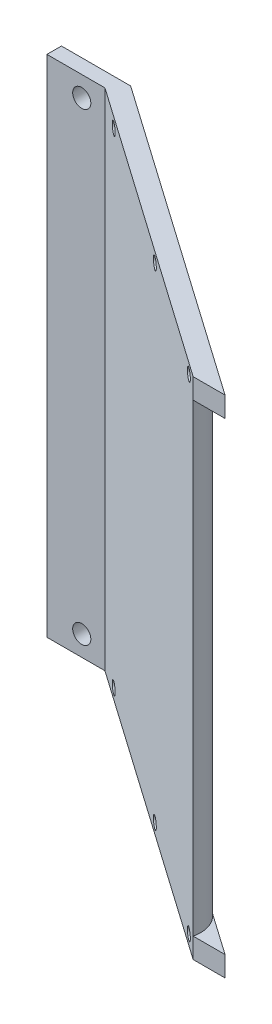
ISO-10303-21;
HEADER;
FILE_DESCRIPTION(('STEP AP214'),'2;1');
FILE_NAME('part.step','',(''),(''),'','','');
FILE_SCHEMA(('AUTOMOTIVE_DESIGN { 1 0 10303 214 1 1 1 1 }'));
ENDSEC;
DATA;
#1=APPLICATION_CONTEXT('core data for automotive mechanical design processes');
#2=APPLICATION_PROTOCOL_DEFINITION('international standard','automotive_design',2000,#1);
#3=PRODUCT_CONTEXT('',#1,'mechanical');
#4=PRODUCT('Part','Part','',(#3));
#5=PRODUCT_RELATED_PRODUCT_CATEGORY('part','',(#4));
#6=PRODUCT_DEFINITION_FORMATION('','',#4);
#7=PRODUCT_DEFINITION_CONTEXT('part definition',#1,'design');
#8=PRODUCT_DEFINITION('design','',#6,#7);
#9=PRODUCT_DEFINITION_SHAPE('','',#8);
#10=(LENGTH_UNIT() NAMED_UNIT(*) SI_UNIT(.MILLI.,.METRE.));
#11=(NAMED_UNIT(*) PLANE_ANGLE_UNIT() SI_UNIT($,.RADIAN.));
#12=(NAMED_UNIT(*) SI_UNIT($,.STERADIAN.) SOLID_ANGLE_UNIT());
#13=UNCERTAINTY_MEASURE_WITH_UNIT(LENGTH_MEASURE(1.E-05),#10,'distance_accuracy_value','');
#14=(GEOMETRIC_REPRESENTATION_CONTEXT(3) GLOBAL_UNCERTAINTY_ASSIGNED_CONTEXT((#13)) GLOBAL_UNIT_ASSIGNED_CONTEXT((#10,
#11,#12)) REPRESENTATION_CONTEXT('',''));
#15=CARTESIAN_POINT('',(0.,0.,0.));
#16=DIRECTION('',(0.,0.,1.));
#17=DIRECTION('',(1.,0.,0.));
#18=AXIS2_PLACEMENT_3D('',#15,#16,#17);
#19=CARTESIAN_POINT('',(-137.811683140464,160.,17.3992487375905));
#20=DIRECTION('',(1.,0.,0.));
#21=DIRECTION('',(0.,0.,-1.));
#22=AXIS2_PLACEMENT_3D('',#19,#20,#21);
#23=PLANE('',#22);
#24=DIRECTION('',(0.,-1.,0.));
#25=VECTOR('',#24,1.);
#26=CARTESIAN_POINT('',(-137.811683140464,160.,17.3992487375905));
#27=LINE('',#26,#25);
#28=CARTESIAN_POINT('',(-137.811683140464,167.,17.3992487375905));
#29=VERTEX_POINT('',#28);
#30=CARTESIAN_POINT('',(-137.811683140464,-7.,17.3992487375905));
#31=VERTEX_POINT('',#30);
#32=EDGE_CURVE('E183',#29,#31,#27,.T.);
#33=ORIENTED_EDGE('',*,*,#32,.T.);
#34=DIRECTION('',(0.,0.,1.));
#35=VECTOR('',#34,1.);
#36=CARTESIAN_POINT('',(-137.811683140464,-7.,17.3992487375905));
#37=LINE('',#36,#35);
#38=CARTESIAN_POINT('',(-137.811683140464,-7.,22.3992487375905));
#39=VERTEX_POINT('',#38);
#40=EDGE_CURVE('E117',#31,#39,#37,.T.);
#41=ORIENTED_EDGE('',*,*,#40,.T.);
#42=DIRECTION('',(0.,-1.,0.));
#43=VECTOR('',#42,1.);
#44=CARTESIAN_POINT('',(-137.811683140464,160.,22.3992487375905));
#45=LINE('',#44,#43);
#46=CARTESIAN_POINT('',(-137.811683140464,167.,22.3992487375905));
#47=VERTEX_POINT('',#46);
#48=EDGE_CURVE('E112',#47,#39,#45,.T.);
#49=ORIENTED_EDGE('',*,*,#48,.F.);
#50=DIRECTION('',(0.,0.,1.));
#51=VECTOR('',#50,1.);
#52=CARTESIAN_POINT('',(-137.811683140464,167.,17.3992487375905));
#53=LINE('',#52,#51);
#54=EDGE_CURVE('E115',#29,#47,#53,.T.);
#55=ORIENTED_EDGE('',*,*,#54,.F.);
#56=EDGE_LOOP('',(#33,#41,#49,#55));
#57=FACE_BOUND('',#56,.T.);
#58=ADVANCED_FACE('F39',(#57),#23,.F.);
#59=CARTESIAN_POINT('',(-137.811683140464,160.,22.3992487375905));
#60=DIRECTION('',(0.,0.,-1.));
#61=DIRECTION('',(-1.,0.,0.));
#62=AXIS2_PLACEMENT_3D('',#59,#60,#61);
#63=PLANE('',#62);
#64=CARTESIAN_POINT('',(-125.811683140464,0.,22.3992487375905));
#65=DIRECTION('',(0.,0.,1.));
#66=DIRECTION('',(1.,0.,0.));
#67=AXIS2_PLACEMENT_3D('',#64,#65,#66);
#68=CIRCLE('',#67,3.125);
#69=CARTESIAN_POINT('',(-122.686683140464,0.,22.3992487375905));
#70=VERTEX_POINT('',#69);
#71=EDGE_CURVE('E216',#70,#70,#68,.T.);
#72=ORIENTED_EDGE('',*,*,#71,.F.);
#73=EDGE_LOOP('',(#72));
#74=FACE_BOUND('',#73,.T.);
#75=CARTESIAN_POINT('',(-125.811683140464,160.,22.3992487375905));
#76=DIRECTION('',(0.,0.,1.));
#77=DIRECTION('',(1.,0.,0.));
#78=AXIS2_PLACEMENT_3D('',#75,#76,#77);
#79=CIRCLE('',#78,3.125);
#80=CARTESIAN_POINT('',(-122.686683140464,160.,22.3992487375905));
#81=VERTEX_POINT('',#80);
#82=EDGE_CURVE('E142',#81,#81,#79,.T.);
#83=ORIENTED_EDGE('',*,*,#82,.F.);
#84=EDGE_LOOP('',(#83));
#85=FACE_BOUND('',#84,.T.);
#86=ORIENTED_EDGE('',*,*,#48,.T.);
#87=DIRECTION('',(1.,0.,0.));
#88=VECTOR('',#87,1.);
#89=CARTESIAN_POINT('',(-137.811683140464,-7.,22.3992487375905));
#90=LINE('',#89,#88);
#91=CARTESIAN_POINT('',(-117.811683140464,-7.,22.3992487375905));
#92=VERTEX_POINT('',#91);
#93=EDGE_CURVE('E161',#39,#92,#90,.T.);
#94=ORIENTED_EDGE('',*,*,#93,.T.);
#95=DIRECTION('',(0.,-1.,0.));
#96=VECTOR('',#95,1.);
#97=CARTESIAN_POINT('',(-117.811683140464,160.,22.3992487375905));
#98=LINE('',#97,#96);
#99=CARTESIAN_POINT('',(-117.811683140464,167.,22.3992487375905));
#100=VERTEX_POINT('',#99);
#101=EDGE_CURVE('E122',#100,#92,#98,.T.);
#102=ORIENTED_EDGE('',*,*,#101,.F.);
#103=DIRECTION('',(1.,0.,0.));
#104=VECTOR('',#103,1.);
#105=CARTESIAN_POINT('',(-137.811683140464,167.,22.3992487375905));
#106=LINE('',#105,#104);
#107=EDGE_CURVE('E125',#47,#100,#106,.T.);
#108=ORIENTED_EDGE('',*,*,#107,.F.);
#109=EDGE_LOOP('',(#86,#94,#102,#108));
#110=FACE_BOUND('',#109,.T.);
#111=ADVANCED_FACE('F126',(#74,#85,#110),#63,.F.);
#112=CARTESIAN_POINT('',(-117.811683140464,160.,22.3992487375905));
#113=DIRECTION('',(0.573576436351047,0.,-0.819152044288991));
#114=DIRECTION('',(-0.819152044288991,0.,-0.573576436351047));
#115=AXIS2_PLACEMENT_3D('',#112,#113,#114);
#116=PLANE('',#115);
#117=CARTESIAN_POINT('',(-60.4420461730597,163.5,62.5699010065213));
#118=DIRECTION('',(-0.573576436351047,0.,0.819152044288991));
#119=DIRECTION('',(0.819152044288991,0.,0.573576436351047));
#120=AXIS2_PLACEMENT_3D('',#117,#118,#119);
#121=CIRCLE('',#120,2.02500000000001);
#122=CARTESIAN_POINT('',(-58.7832632833745,163.5,63.7313932901322));
#123=VERTEX_POINT('',#122);
#124=EDGE_CURVE('E226',#123,#123,#121,.T.);
#125=ORIENTED_EDGE('',*,*,#124,.F.);
#126=EDGE_LOOP('',(#125));
#127=FACE_BOUND('',#126,.T.);
#128=CARTESIAN_POINT('',(-107.756268251192,163.5,29.4401260428848));
#129=DIRECTION('',(-0.573576436351047,0.,0.819152044288991));
#130=DIRECTION('',(0.819152044288991,0.,0.573576436351047));
#131=AXIS2_PLACEMENT_3D('',#128,#129,#130);
#132=CIRCLE('',#131,2.02500000000001);
#133=CARTESIAN_POINT('',(-106.097485361507,163.5,30.6016183264957));
#134=VERTEX_POINT('',#133);
#135=EDGE_CURVE('E234',#134,#134,#132,.T.);
#136=ORIENTED_EDGE('',*,*,#135,.F.);
#137=EDGE_LOOP('',(#136));
#138=FACE_BOUND('',#137,.T.);
#139=CARTESIAN_POINT('',(-21.3193445378175,-3.5,89.9639116066473));
#140=DIRECTION('',(-0.573576436351047,0.,0.819152044288991));
#141=DIRECTION('',(0.819152044288991,0.,0.573576436351047));
#142=AXIS2_PLACEMENT_3D('',#139,#140,#141);
#143=CIRCLE('',#142,2.025);
#144=CARTESIAN_POINT('',(-19.6605616481323,-3.5,91.1254038902582));
#145=VERTEX_POINT('',#144);
#146=EDGE_CURVE('E230',#145,#145,#143,.T.);
#147=ORIENTED_EDGE('',*,*,#146,.F.);
#148=EDGE_LOOP('',(#147));
#149=FACE_BOUND('',#148,.T.);
#150=CARTESIAN_POINT('',(-60.4420461730597,-3.5,62.5699010065213));
#151=DIRECTION('',(-0.573576436351047,0.,0.819152044288991));
#152=DIRECTION('',(0.819152044288991,0.,0.573576436351047));
#153=AXIS2_PLACEMENT_3D('',#150,#151,#152);
#154=CIRCLE('',#153,2.025);
#155=CARTESIAN_POINT('',(-58.7832632833745,-3.5,63.7313932901322));
#156=VERTEX_POINT('',#155);
#157=EDGE_CURVE('E227',#156,#156,#154,.T.);
#158=ORIENTED_EDGE('',*,*,#157,.F.);
#159=EDGE_LOOP('',(#158));
#160=FACE_BOUND('',#159,.T.);
#161=CARTESIAN_POINT('',(-107.756268251192,-3.5,29.4401260428848));
#162=DIRECTION('',(-0.573576436351047,0.,0.819152044288991));
#163=DIRECTION('',(0.819152044288991,0.,0.573576436351047));
#164=AXIS2_PLACEMENT_3D('',#161,#162,#163);
#165=CIRCLE('',#164,2.025);
#166=CARTESIAN_POINT('',(-106.097485361507,-3.5,30.6016183264957));
#167=VERTEX_POINT('',#166);
#168=EDGE_CURVE('E231',#167,#167,#165,.T.);
#169=ORIENTED_EDGE('',*,*,#168,.F.);
#170=EDGE_LOOP('',(#169));
#171=FACE_BOUND('',#170,.T.);
#172=CARTESIAN_POINT('',(-21.3193445378175,163.5,89.9639116066473));
#173=DIRECTION('',(-0.573576436351047,0.,0.819152044288991));
#174=DIRECTION('',(0.819152044288991,0.,0.573576436351047));
#175=AXIS2_PLACEMENT_3D('',#172,#173,#174);
#176=CIRCLE('',#175,2.025);
#177=CARTESIAN_POINT('',(-19.6605616481323,163.5,91.1254038902582));
#178=VERTEX_POINT('',#177);
#179=EDGE_CURVE('E196',#178,#178,#176,.T.);
#180=ORIENTED_EDGE('',*,*,#179,.F.);
#181=EDGE_LOOP('',(#180));
#182=FACE_BOUND('',#181,.T.);
#183=ORIENTED_EDGE('',*,*,#101,.T.);
#184=DIRECTION('',(0.819152044288991,0.,0.573576436351047));
#185=VECTOR('',#184,1.);
#186=CARTESIAN_POINT('',(-117.811683140464,-7.,22.3992487375905));
#187=LINE('',#186,#185);
#188=CARTESIAN_POINT('',(-16.4131746617738,-7.,93.3992487375905));
#189=VERTEX_POINT('',#188);
#190=EDGE_CURVE('E164',#92,#189,#187,.T.);
#191=ORIENTED_EDGE('',*,*,#190,.T.);
#192=DIRECTION('',(0.,1.,0.));
#193=VECTOR('',#192,1.);
#194=CARTESIAN_POINT('',(-16.4131746617738,-7.,93.3992487375905));
#195=LINE('',#194,#193);
#196=CARTESIAN_POINT('',(-16.4131746617738,0.,93.3992487375905));
#197=VERTEX_POINT('',#196);
#198=EDGE_CURVE('E176',#189,#197,#195,.T.);
#199=ORIENTED_EDGE('',*,*,#198,.T.);
#200=DIRECTION('',(0.,-1.,0.));
#201=VECTOR('',#200,1.);
#202=CARTESIAN_POINT('',(-16.4131746617738,160.,93.3992487375905));
#203=LINE('',#202,#201);
#204=CARTESIAN_POINT('',(-16.4131746617738,160.,93.3992487375905));
#205=VERTEX_POINT('',#204);
#206=EDGE_CURVE('E62',#205,#197,#203,.T.);
#207=ORIENTED_EDGE('',*,*,#206,.F.);
#208=DIRECTION('',(0.,-1.,0.));
#209=VECTOR('',#208,1.);
#210=CARTESIAN_POINT('',(-16.4131746617738,167.,93.3992487375905));
#211=LINE('',#210,#209);
#212=CARTESIAN_POINT('',(-16.4131746617738,167.,93.3992487375905));
#213=VERTEX_POINT('',#212);
#214=EDGE_CURVE('E156',#213,#205,#211,.T.);
#215=ORIENTED_EDGE('',*,*,#214,.F.);
#216=DIRECTION('',(0.819152044288991,0.,0.573576436351047));
#217=VECTOR('',#216,1.);
#218=CARTESIAN_POINT('',(-117.811683140464,167.,22.3992487375905));
#219=LINE('',#218,#217);
#220=EDGE_CURVE('E129',#100,#213,#219,.T.);
#221=ORIENTED_EDGE('',*,*,#220,.F.);
#222=EDGE_LOOP('',(#183,#191,#199,#207,#215,#221));
#223=FACE_BOUND('',#222,.T.);
#224=ADVANCED_FACE('F245',(#127,#138,#149,#160,#171,#182,#223),#116,.F.);
#225=CARTESIAN_POINT('',(-113.952423174174,160.,17.3992487375905));
#226=DIRECTION('',(-0.573576436351047,0.,0.819152044288991));
#227=DIRECTION('',(0.819152044288991,0.,0.573576436351047));
#228=AXIS2_PLACEMENT_3D('',#225,#226,#227);
#229=PLANE('',#228);
#230=CARTESIAN_POINT('',(-56.8231569613508,163.5,57.4015915921988));
#231=DIRECTION('',(-0.573576436351047,0.,0.819152044288991));
#232=DIRECTION('',(0.819152044288991,0.,0.573576436351047));
#233=AXIS2_PLACEMENT_3D('',#230,#231,#232);
#234=CIRCLE('',#233,2.02500000000001);
#235=CARTESIAN_POINT('',(-55.1643740716656,163.5,58.5630838758097));
#236=VERTEX_POINT('',#235);
#237=EDGE_CURVE('E43',#236,#236,#234,.T.);
#238=ORIENTED_EDGE('',*,*,#237,.T.);
#239=EDGE_LOOP('',(#238));
#240=FACE_BOUND('',#239,.T.);
#241=CARTESIAN_POINT('',(-104.137379039483,163.5,24.2718166285623));
#242=DIRECTION('',(-0.573576436351047,0.,0.819152044288991));
#243=DIRECTION('',(0.819152044288991,0.,0.573576436351047));
#244=AXIS2_PLACEMENT_3D('',#241,#242,#243);
#245=CIRCLE('',#244,2.02500000000001);
#246=CARTESIAN_POINT('',(-102.478596149798,163.5,25.4333089121732));
#247=VERTEX_POINT('',#246);
#248=EDGE_CURVE('E204',#247,#247,#245,.T.);
#249=ORIENTED_EDGE('',*,*,#248,.T.);
#250=EDGE_LOOP('',(#249));
#251=FACE_BOUND('',#250,.T.);
#252=CARTESIAN_POINT('',(-17.7004553261086,-3.5,84.7956021923248));
#253=DIRECTION('',(-0.573576436351047,0.,0.819152044288991));
#254=DIRECTION('',(0.819152044288991,0.,0.573576436351047));
#255=AXIS2_PLACEMENT_3D('',#252,#253,#254);
#256=CIRCLE('',#255,2.025);
#257=CARTESIAN_POINT('',(-16.0416724364234,-3.5,85.9570944759357));
#258=VERTEX_POINT('',#257);
#259=EDGE_CURVE('E202',#258,#258,#256,.T.);
#260=ORIENTED_EDGE('',*,*,#259,.T.);
#261=EDGE_LOOP('',(#260));
#262=FACE_BOUND('',#261,.T.);
#263=CARTESIAN_POINT('',(-56.8231569613508,-3.5,57.4015915921988));
#264=DIRECTION('',(-0.573576436351047,0.,0.819152044288991));
#265=DIRECTION('',(0.819152044288991,0.,0.573576436351047));
#266=AXIS2_PLACEMENT_3D('',#263,#264,#265);
#267=CIRCLE('',#266,2.025);
#268=CARTESIAN_POINT('',(-55.1643740716656,-3.5,58.5630838758097));
#269=VERTEX_POINT('',#268);
#270=EDGE_CURVE('E199',#269,#269,#267,.T.);
#271=ORIENTED_EDGE('',*,*,#270,.T.);
#272=EDGE_LOOP('',(#271));
#273=FACE_BOUND('',#272,.T.);
#274=CARTESIAN_POINT('',(-104.137379039483,-3.5,24.2718166285623));
#275=DIRECTION('',(-0.573576436351047,0.,0.819152044288991));
#276=DIRECTION('',(0.819152044288991,0.,0.573576436351047));
#277=AXIS2_PLACEMENT_3D('',#274,#275,#276);
#278=CIRCLE('',#277,2.025);
#279=CARTESIAN_POINT('',(-102.478596149798,-3.5,25.4333089121732));
#280=VERTEX_POINT('',#279);
#281=EDGE_CURVE('E195',#280,#280,#278,.T.);
#282=ORIENTED_EDGE('',*,*,#281,.T.);
#283=EDGE_LOOP('',(#282));
#284=FACE_BOUND('',#283,.T.);
#285=CARTESIAN_POINT('',(-17.7004553261086,163.5,84.7956021923248));
#286=DIRECTION('',(-0.573576436351047,0.,0.819152044288991));
#287=DIRECTION('',(0.819152044288991,0.,0.573576436351047));
#288=AXIS2_PLACEMENT_3D('',#285,#286,#287);
#289=CIRCLE('',#288,2.025);
#290=CARTESIAN_POINT('',(-16.0416724364234,163.5,85.9570944759357));
#291=VERTEX_POINT('',#290);
#292=EDGE_CURVE('E192',#291,#291,#289,.T.);
#293=ORIENTED_EDGE('',*,*,#292,.T.);
#294=EDGE_LOOP('',(#293));
#295=FACE_BOUND('',#294,.T.);
#296=DIRECTION('',(0.,-1.,0.));
#297=VECTOR('',#296,1.);
#298=CARTESIAN_POINT('',(-113.952423174174,160.,17.3992487375905));
#299=LINE('',#298,#297);
#300=CARTESIAN_POINT('',(-113.952423174174,167.,17.3992487375905));
#301=VERTEX_POINT('',#300);
#302=CARTESIAN_POINT('',(-113.952423174174,-7.,17.3992487375905));
#303=VERTEX_POINT('',#302);
#304=EDGE_CURVE('E186',#301,#303,#299,.T.);
#305=ORIENTED_EDGE('',*,*,#304,.F.);
#306=DIRECTION('',(-0.819152044288991,0.,-0.573576436351047));
#307=VECTOR('',#306,1.);
#308=CARTESIAN_POINT('',(-113.952423174174,167.,17.3992487375905));
#309=LINE('',#308,#307);
#310=CARTESIAN_POINT('',(-5.41317466177378,167.,93.3992487375905));
#311=VERTEX_POINT('',#310);
#312=EDGE_CURVE('E148',#311,#301,#309,.T.);
#313=ORIENTED_EDGE('',*,*,#312,.F.);
#314=DIRECTION('',(0.,-1.,0.));
#315=VECTOR('',#314,1.);
#316=CARTESIAN_POINT('',(-5.41317466177378,167.,93.3992487375905));
#317=LINE('',#316,#315);
#318=CARTESIAN_POINT('',(-5.41317466177378,160.,93.3992487375905));
#319=VERTEX_POINT('',#318);
#320=EDGE_CURVE('E151',#311,#319,#317,.T.);
#321=ORIENTED_EDGE('',*,*,#320,.T.);
#322=DIRECTION('',(-0.819152044288991,0.,-0.573576436351047));
#323=VECTOR('',#322,1.);
#324=CARTESIAN_POINT('',(-113.952423174174,160.,17.3992487375905));
#325=LINE('',#324,#323);
#326=CARTESIAN_POINT('',(-20.4075109322789,160.,82.9001014505315));
#327=VERTEX_POINT('',#326);
#328=EDGE_CURVE('E136',#319,#327,#325,.T.);
#329=ORIENTED_EDGE('',*,*,#328,.T.);
#330=DIRECTION('',(0.,-1.,0.));
#331=VECTOR('',#330,1.);
#332=CARTESIAN_POINT('',(-20.4075109322789,160.,82.9001014505315));
#333=LINE('',#332,#331);
#334=CARTESIAN_POINT('',(-20.4075109322789,0.,82.9001014505315));
#335=VERTEX_POINT('',#334);
#336=EDGE_CURVE('E121',#327,#335,#333,.T.);
#337=ORIENTED_EDGE('',*,*,#336,.T.);
#338=DIRECTION('',(-0.819152044288991,0.,-0.573576436351047));
#339=VECTOR('',#338,1.);
#340=CARTESIAN_POINT('',(-113.952423174174,0.,17.3992487375905));
#341=LINE('',#340,#339);
#342=CARTESIAN_POINT('',(-5.41317466177378,0.,93.3992487375905));
#343=VERTEX_POINT('',#342);
#344=EDGE_CURVE('E162',#343,#335,#341,.T.);
#345=ORIENTED_EDGE('',*,*,#344,.F.);
#346=DIRECTION('',(0.,1.,0.));
#347=VECTOR('',#346,1.);
#348=CARTESIAN_POINT('',(-5.41317466177378,-7.,93.3992487375905));
#349=LINE('',#348,#347);
#350=CARTESIAN_POINT('',(-5.41317466177378,-7.,93.3992487375905));
#351=VERTEX_POINT('',#350);
#352=EDGE_CURVE('E181',#351,#343,#349,.T.);
#353=ORIENTED_EDGE('',*,*,#352,.F.);
#354=DIRECTION('',(-0.819152044288991,0.,-0.573576436351047));
#355=VECTOR('',#354,1.);
#356=CARTESIAN_POINT('',(-113.952423174174,-7.,17.3992487375905));
#357=LINE('',#356,#355);
#358=EDGE_CURVE('E170',#351,#303,#357,.T.);
#359=ORIENTED_EDGE('',*,*,#358,.T.);
#360=EDGE_LOOP('',(#305,#313,#321,#329,#337,#345,#353,#359));
#361=FACE_BOUND('',#360,.T.);
#362=ADVANCED_FACE('F248',(#240,#251,#262,#273,#284,#295,#361),#229,.F.);
#363=CARTESIAN_POINT('',(-137.811683140464,160.,17.3992487375905));
#364=DIRECTION('',(0.,0.,1.));
#365=DIRECTION('',(1.,0.,0.));
#366=AXIS2_PLACEMENT_3D('',#363,#364,#365);
#367=PLANE('',#366);
#368=ORIENTED_EDGE('',*,*,#304,.T.);
#369=DIRECTION('',(-1.,0.,0.));
#370=VECTOR('',#369,1.);
#371=CARTESIAN_POINT('',(-137.811683140464,-7.,17.3992487375905));
#372=LINE('',#371,#370);
#373=EDGE_CURVE('E173',#303,#31,#372,.T.);
#374=ORIENTED_EDGE('',*,*,#373,.T.);
#375=ORIENTED_EDGE('',*,*,#32,.F.);
#376=DIRECTION('',(-1.,0.,0.));
#377=VECTOR('',#376,1.);
#378=CARTESIAN_POINT('',(-137.811683140464,167.,17.3992487375905));
#379=LINE('',#378,#377);
#380=EDGE_CURVE('E135',#301,#29,#379,.T.);
#381=ORIENTED_EDGE('',*,*,#380,.F.);
#382=EDGE_LOOP('',(#368,#374,#375,#381));
#383=FACE_BOUND('',#382,.T.);
#384=ADVANCED_FACE('F275',(#383),#367,.F.);
#385=CARTESIAN_POINT('',(-26.1432752957894,160.,91.0916218934214));
#386=DIRECTION('',(0.,-1.,0.));
#387=DIRECTION('',(0.,0.,-1.));
#388=AXIS2_PLACEMENT_3D('',#385,#386,#387);
#389=CYLINDRICAL_SURFACE('',#388,10.);
#390=CARTESIAN_POINT('',(-26.1432752957894,160.,91.0916218934214));
#391=DIRECTION('',(0.,1.,0.));
#392=DIRECTION('',(0.,0.,1.));
#393=AXIS2_PLACEMENT_3D('',#390,#391,#392);
#394=CIRCLE('',#393,10.);
#395=EDGE_CURVE('E11',#205,#327,#394,.T.);
#396=ORIENTED_EDGE('',*,*,#395,.F.);
#397=ORIENTED_EDGE('',*,*,#206,.T.);
#398=CARTESIAN_POINT('',(-26.1432752957894,0.,91.0916218934214));
#399=DIRECTION('',(0.,1.,0.));
#400=DIRECTION('',(0.,0.,1.));
#401=AXIS2_PLACEMENT_3D('',#398,#399,#400);
#402=CIRCLE('',#401,10.);
#403=EDGE_CURVE('E48',#335,#197,#402,.F.);
#404=ORIENTED_EDGE('',*,*,#403,.F.);
#405=ORIENTED_EDGE('',*,*,#336,.F.);
#406=EDGE_LOOP('',(#396,#397,#404,#405));
#407=FACE_BOUND('',#406,.T.);
#408=ADVANCED_FACE('F41',(#407),#389,.T.);
#409=CARTESIAN_POINT('',(-16.4131746617738,-7.,93.3992487375905));
#410=DIRECTION('',(0.,0.,1.));
#411=DIRECTION('',(1.,0.,0.));
#412=AXIS2_PLACEMENT_3D('',#409,#410,#411);
#413=PLANE('',#412);
#414=DIRECTION('',(1.,0.,0.));
#415=VECTOR('',#414,1.);
#416=CARTESIAN_POINT('',(-16.4131746617738,0.,93.3992487375905));
#417=LINE('',#416,#415);
#418=EDGE_CURVE('E159',#197,#343,#417,.T.);
#419=ORIENTED_EDGE('',*,*,#418,.F.);
#420=ORIENTED_EDGE('',*,*,#198,.F.);
#421=DIRECTION('',(1.,0.,0.));
#422=VECTOR('',#421,1.);
#423=CARTESIAN_POINT('',(-16.4131746617738,-7.,93.3992487375905));
#424=LINE('',#423,#422);
#425=EDGE_CURVE('E167',#189,#351,#424,.T.);
#426=ORIENTED_EDGE('',*,*,#425,.T.);
#427=ORIENTED_EDGE('',*,*,#352,.T.);
#428=EDGE_LOOP('',(#419,#420,#426,#427));
#429=FACE_BOUND('',#428,.T.);
#430=ADVANCED_FACE('F260',(#429),#413,.T.);
#431=CARTESIAN_POINT('',(0.,-7.,0.));
#432=DIRECTION('',(0.,1.,0.));
#433=DIRECTION('',(0.,0.,1.));
#434=AXIS2_PLACEMENT_3D('',#431,#432,#433);
#435=PLANE('',#434);
#436=ORIENTED_EDGE('',*,*,#40,.F.);
#437=ORIENTED_EDGE('',*,*,#373,.F.);
#438=ORIENTED_EDGE('',*,*,#358,.F.);
#439=ORIENTED_EDGE('',*,*,#425,.F.);
#440=ORIENTED_EDGE('',*,*,#190,.F.);
#441=ORIENTED_EDGE('',*,*,#93,.F.);
#442=EDGE_LOOP('',(#436,#437,#438,#439,#440,#441));
#443=FACE_BOUND('',#442,.T.);
#444=ADVANCED_FACE('F255',(#443),#435,.F.);
#445=CARTESIAN_POINT('',(0.,0.,0.));
#446=DIRECTION('',(0.,1.,0.));
#447=DIRECTION('',(0.,0.,1.));
#448=AXIS2_PLACEMENT_3D('',#445,#446,#447);
#449=PLANE('',#448);
#450=ORIENTED_EDGE('',*,*,#344,.T.);
#451=ORIENTED_EDGE('',*,*,#403,.T.);
#452=ORIENTED_EDGE('',*,*,#418,.T.);
#453=EDGE_LOOP('',(#450,#451,#452));
#454=FACE_BOUND('',#453,.T.);
#455=ADVANCED_FACE('F263',(#454),#449,.T.);
#456=CARTESIAN_POINT('',(0.,160.,0.));
#457=DIRECTION('',(0.,1.,0.));
#458=DIRECTION('',(0.,0.,1.));
#459=AXIS2_PLACEMENT_3D('',#456,#457,#458);
#460=PLANE('',#459);
#461=DIRECTION('',(1.,0.,0.));
#462=VECTOR('',#461,1.);
#463=CARTESIAN_POINT('',(-16.4131746617738,160.,93.3992487375905));
#464=LINE('',#463,#462);
#465=EDGE_CURVE('E139',#205,#319,#464,.T.);
#466=ORIENTED_EDGE('',*,*,#465,.F.);
#467=ORIENTED_EDGE('',*,*,#395,.T.);
#468=ORIENTED_EDGE('',*,*,#328,.F.);
#469=EDGE_LOOP('',(#466,#467,#468));
#470=FACE_BOUND('',#469,.T.);
#471=ADVANCED_FACE('F268',(#470),#460,.F.);
#472=CARTESIAN_POINT('',(-16.4131746617738,167.,93.3992487375905));
#473=DIRECTION('',(0.,0.,-1.));
#474=DIRECTION('',(-1.,0.,0.));
#475=AXIS2_PLACEMENT_3D('',#472,#473,#474);
#476=PLANE('',#475);
#477=ORIENTED_EDGE('',*,*,#465,.T.);
#478=ORIENTED_EDGE('',*,*,#320,.F.);
#479=DIRECTION('',(1.,0.,0.));
#480=VECTOR('',#479,1.);
#481=CARTESIAN_POINT('',(-16.4131746617738,167.,93.3992487375905));
#482=LINE('',#481,#480);
#483=EDGE_CURVE('E146',#213,#311,#482,.T.);
#484=ORIENTED_EDGE('',*,*,#483,.F.);
#485=ORIENTED_EDGE('',*,*,#214,.T.);
#486=EDGE_LOOP('',(#477,#478,#484,#485));
#487=FACE_BOUND('',#486,.T.);
#488=ADVANCED_FACE('F271',(#487),#476,.F.);
#489=CARTESIAN_POINT('',(0.,167.,0.));
#490=DIRECTION('',(0.,1.,0.));
#491=DIRECTION('',(0.,0.,1.));
#492=AXIS2_PLACEMENT_3D('',#489,#490,#491);
#493=PLANE('',#492);
#494=ORIENTED_EDGE('',*,*,#54,.T.);
#495=ORIENTED_EDGE('',*,*,#107,.T.);
#496=ORIENTED_EDGE('',*,*,#220,.T.);
#497=ORIENTED_EDGE('',*,*,#483,.T.);
#498=ORIENTED_EDGE('',*,*,#312,.T.);
#499=ORIENTED_EDGE('',*,*,#380,.T.);
#500=EDGE_LOOP('',(#494,#495,#496,#497,#498,#499));
#501=FACE_BOUND('',#500,.T.);
#502=ADVANCED_FACE('F132',(#501),#493,.T.);
#503=CARTESIAN_POINT('',(-125.811683140464,160.,17.6992487375905));
#504=DIRECTION('',(0.,0.,1.));
#505=DIRECTION('',(1.,0.,0.));
#506=AXIS2_PLACEMENT_3D('',#503,#504,#505);
#507=CYLINDRICAL_SURFACE('',#506,3.125);
#508=CARTESIAN_POINT('',(-125.811683140464,160.,17.6992487375905));
#509=DIRECTION('',(0.,0.,1.));
#510=DIRECTION('',(1.,0.,0.));
#511=AXIS2_PLACEMENT_3D('',#508,#509,#510);
#512=CIRCLE('',#511,3.125);
#513=CARTESIAN_POINT('',(-122.686683140464,160.,17.6992487375905));
#514=VERTEX_POINT('',#513);
#515=EDGE_CURVE('E212',#514,#514,#512,.T.);
#516=ORIENTED_EDGE('',*,*,#515,.F.);
#517=EDGE_LOOP('',(#516));
#518=FACE_BOUND('',#517,.T.);
#519=ORIENTED_EDGE('',*,*,#82,.T.);
#520=EDGE_LOOP('',(#519));
#521=FACE_BOUND('',#520,.T.);
#522=ADVANCED_FACE('F308',(#518,#521),#507,.F.);
#523=CARTESIAN_POINT('',(-125.811683140464,160.,17.6992487375905));
#524=DIRECTION('',(0.,0.,1.));
#525=DIRECTION('',(1.,0.,0.));
#526=AXIS2_PLACEMENT_3D('',#523,#524,#525);
#527=PLANE('',#526);
#528=ORIENTED_EDGE('',*,*,#515,.T.);
#529=EDGE_LOOP('',(#528));
#530=FACE_BOUND('',#529,.T.);
#531=ADVANCED_FACE('F298',(#530),#527,.T.);
#532=CARTESIAN_POINT('',(-125.811683140464,0.,17.6992487375905));
#533=DIRECTION('',(0.,0.,1.));
#534=DIRECTION('',(1.,0.,0.));
#535=AXIS2_PLACEMENT_3D('',#532,#533,#534);
#536=CYLINDRICAL_SURFACE('',#535,3.125);
#537=CARTESIAN_POINT('',(-125.811683140464,0.,17.6992487375905));
#538=DIRECTION('',(0.,0.,1.));
#539=DIRECTION('',(1.,0.,0.));
#540=AXIS2_PLACEMENT_3D('',#537,#538,#539);
#541=CIRCLE('',#540,3.125);
#542=CARTESIAN_POINT('',(-122.686683140464,0.,17.6992487375905));
#543=VERTEX_POINT('',#542);
#544=EDGE_CURVE('E152',#543,#543,#541,.T.);
#545=ORIENTED_EDGE('',*,*,#544,.F.);
#546=EDGE_LOOP('',(#545));
#547=FACE_BOUND('',#546,.T.);
#548=ORIENTED_EDGE('',*,*,#71,.T.);
#549=EDGE_LOOP('',(#548));
#550=FACE_BOUND('',#549,.T.);
#551=ADVANCED_FACE('F295',(#547,#550),#536,.F.);
#552=CARTESIAN_POINT('',(-125.811683140464,0.,17.6992487375905));
#553=DIRECTION('',(0.,0.,1.));
#554=DIRECTION('',(1.,0.,0.));
#555=AXIS2_PLACEMENT_3D('',#552,#553,#554);
#556=PLANE('',#555);
#557=ORIENTED_EDGE('',*,*,#544,.T.);
#558=EDGE_LOOP('',(#557));
#559=FACE_BOUND('',#558,.T.);
#560=ADVANCED_FACE('F297',(#559),#556,.T.);
#561=CARTESIAN_POINT('',(-17.3043094833602,163.5,84.2298472966244));
#562=DIRECTION('',(-0.573576436351047,0.,0.819152044288991));
#563=DIRECTION('',(0.819152044288991,0.,0.573576436351047));
#564=AXIS2_PLACEMENT_3D('',#561,#562,#563);
#565=CYLINDRICAL_SURFACE('',#564,2.025);
#566=ORIENTED_EDGE('',*,*,#179,.T.);
#567=EDGE_LOOP('',(#566));
#568=FACE_BOUND('',#567,.T.);
#569=ORIENTED_EDGE('',*,*,#292,.F.);
#570=EDGE_LOOP('',(#569));
#571=FACE_BOUND('',#570,.T.);
#572=ADVANCED_FACE('F305',(#568,#571),#565,.F.);
#573=CARTESIAN_POINT('',(-103.741233196735,-3.5,23.7060617328619));
#574=DIRECTION('',(-0.573576436351047,0.,0.819152044288991));
#575=DIRECTION('',(0.819152044288991,0.,0.573576436351047));
#576=AXIS2_PLACEMENT_3D('',#573,#574,#575);
#577=CYLINDRICAL_SURFACE('',#576,2.025);
#578=ORIENTED_EDGE('',*,*,#168,.T.);
#579=EDGE_LOOP('',(#578));
#580=FACE_BOUND('',#579,.T.);
#581=ORIENTED_EDGE('',*,*,#281,.F.);
#582=EDGE_LOOP('',(#581));
#583=FACE_BOUND('',#582,.T.);
#584=ADVANCED_FACE('F242',(#580,#583),#577,.F.);
#585=CARTESIAN_POINT('',(-56.4270111186024,-3.5,56.8358366964984));
#586=DIRECTION('',(-0.573576436351047,0.,0.819152044288991));
#587=DIRECTION('',(0.819152044288991,0.,0.573576436351047));
#588=AXIS2_PLACEMENT_3D('',#585,#586,#587);
#589=CYLINDRICAL_SURFACE('',#588,2.025);
#590=ORIENTED_EDGE('',*,*,#157,.T.);
#591=EDGE_LOOP('',(#590));
#592=FACE_BOUND('',#591,.T.);
#593=ORIENTED_EDGE('',*,*,#270,.F.);
#594=EDGE_LOOP('',(#593));
#595=FACE_BOUND('',#594,.T.);
#596=ADVANCED_FACE('F401',(#592,#595),#589,.F.);
#597=CARTESIAN_POINT('',(-17.3043094833602,-3.5,84.2298472966244));
#598=DIRECTION('',(-0.573576436351047,0.,0.819152044288991));
#599=DIRECTION('',(0.819152044288991,0.,0.573576436351047));
#600=AXIS2_PLACEMENT_3D('',#597,#598,#599);
#601=CYLINDRICAL_SURFACE('',#600,2.025);
#602=ORIENTED_EDGE('',*,*,#146,.T.);
#603=EDGE_LOOP('',(#602));
#604=FACE_BOUND('',#603,.T.);
#605=ORIENTED_EDGE('',*,*,#259,.F.);
#606=EDGE_LOOP('',(#605));
#607=FACE_BOUND('',#606,.T.);
#608=ADVANCED_FACE('F410',(#604,#607),#601,.F.);
#609=CARTESIAN_POINT('',(-103.741233196735,163.5,23.7060617328619));
#610=DIRECTION('',(-0.573576436351047,0.,0.819152044288991));
#611=DIRECTION('',(0.819152044288991,0.,0.573576436351047));
#612=AXIS2_PLACEMENT_3D('',#609,#610,#611);
#613=CYLINDRICAL_SURFACE('',#612,2.02500000000001);
#614=ORIENTED_EDGE('',*,*,#135,.T.);
#615=EDGE_LOOP('',(#614));
#616=FACE_BOUND('',#615,.T.);
#617=ORIENTED_EDGE('',*,*,#248,.F.);
#618=EDGE_LOOP('',(#617));
#619=FACE_BOUND('',#618,.T.);
#620=ADVANCED_FACE('F420',(#616,#619),#613,.F.);
#621=CARTESIAN_POINT('',(-56.4270111186024,163.5,56.8358366964984));
#622=DIRECTION('',(-0.573576436351047,0.,0.819152044288991));
#623=DIRECTION('',(0.819152044288991,0.,0.573576436351047));
#624=AXIS2_PLACEMENT_3D('',#621,#622,#623);
#625=CYLINDRICAL_SURFACE('',#624,2.02500000000001);
#626=ORIENTED_EDGE('',*,*,#124,.T.);
#627=EDGE_LOOP('',(#626));
#628=FACE_BOUND('',#627,.T.);
#629=ORIENTED_EDGE('',*,*,#237,.F.);
#630=EDGE_LOOP('',(#629));
#631=FACE_BOUND('',#630,.T.);
#632=ADVANCED_FACE('F430',(#628,#631),#625,.F.);
#633=CLOSED_SHELL('',(#58,#111,#224,#362,#384,#408,#430,#444,#455,#471,#488,#502,#522,#531,#551,
#560,#572,#584,#596,#608,#620,#632));
#634=MANIFOLD_SOLID_BREP('B2',#633);
#635=ADVANCED_BREP_SHAPE_REPRESENTATION('',(#18,#634),#14);
#636=SHAPE_DEFINITION_REPRESENTATION(#9,#635);
ENDSEC;
END-ISO-10303-21;
